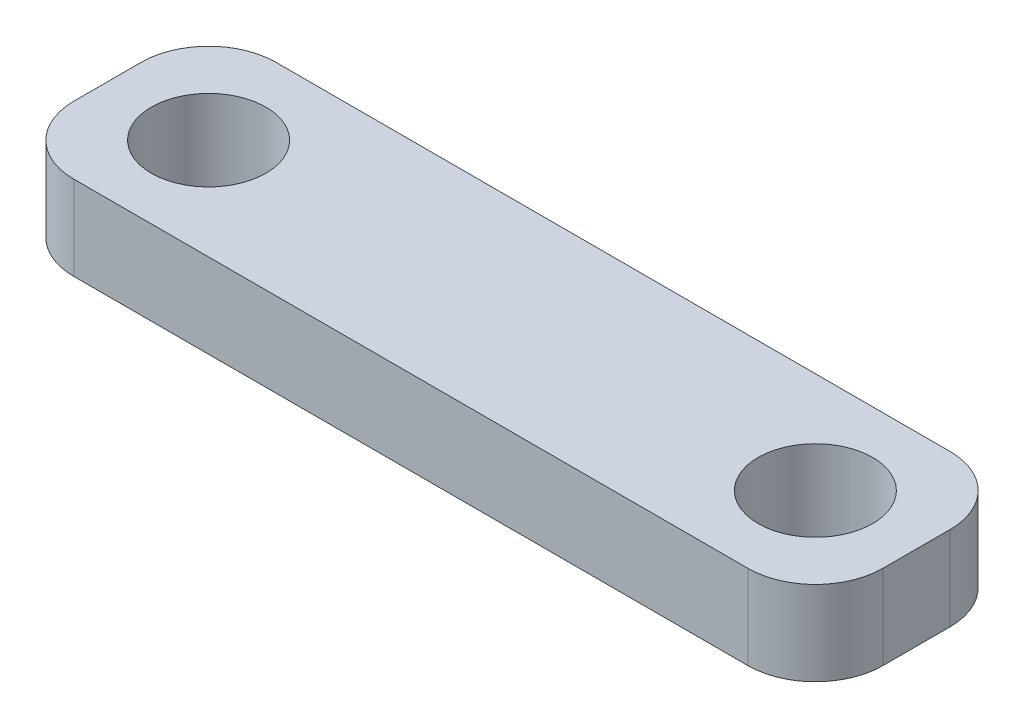
ISO-10303-21;
HEADER;
FILE_DESCRIPTION(('STEP AP214'),'2;1');
FILE_NAME('part.step','',(''),(''),'','','');
FILE_SCHEMA(('AUTOMOTIVE_DESIGN { 1 0 10303 214 1 1 1 1 }'));
ENDSEC;
DATA;
#1=APPLICATION_CONTEXT('core data for automotive mechanical design processes');
#2=APPLICATION_PROTOCOL_DEFINITION('international standard','automotive_design',2000,#1);
#3=PRODUCT_CONTEXT('',#1,'mechanical');
#4=PRODUCT('Part','Part','',(#3));
#5=PRODUCT_RELATED_PRODUCT_CATEGORY('part','',(#4));
#6=PRODUCT_DEFINITION_FORMATION('','',#4);
#7=PRODUCT_DEFINITION_CONTEXT('part definition',#1,'design');
#8=PRODUCT_DEFINITION('design','',#6,#7);
#9=PRODUCT_DEFINITION_SHAPE('','',#8);
#10=(LENGTH_UNIT() NAMED_UNIT(*) SI_UNIT(.MILLI.,.METRE.));
#11=(NAMED_UNIT(*) PLANE_ANGLE_UNIT() SI_UNIT($,.RADIAN.));
#12=(NAMED_UNIT(*) SI_UNIT($,.STERADIAN.) SOLID_ANGLE_UNIT());
#13=UNCERTAINTY_MEASURE_WITH_UNIT(LENGTH_MEASURE(1.E-05),#10,'distance_accuracy_value','');
#14=(GEOMETRIC_REPRESENTATION_CONTEXT(3) GLOBAL_UNCERTAINTY_ASSIGNED_CONTEXT((#13)) GLOBAL_UNIT_ASSIGNED_CONTEXT((#10,
#11,#12)) REPRESENTATION_CONTEXT('',''));
#15=CARTESIAN_POINT('',(0.,0.,0.));
#16=DIRECTION('',(0.,0.,1.));
#17=DIRECTION('',(1.,0.,0.));
#18=AXIS2_PLACEMENT_3D('',#15,#16,#17);
#19=CARTESIAN_POINT('',(10.,2.5,1.));
#20=DIRECTION('',(0.,1.,0.));
#21=DIRECTION('',(0.,0.,1.));
#22=AXIS2_PLACEMENT_3D('',#19,#20,#21);
#23=PLANE('',#22);
#24=CARTESIAN_POINT('',(-9.,2.5,0.));
#25=DIRECTION('',(0.,1.,0.));
#26=DIRECTION('',(0.,0.,1.));
#27=AXIS2_PLACEMENT_3D('',#24,#25,#26);
#28=CIRCLE('',#27,1.7);
#29=CARTESIAN_POINT('',(-9.,2.5,1.7));
#30=VERTEX_POINT('',#29);
#31=EDGE_CURVE('E150',#30,#30,#28,.T.);
#32=ORIENTED_EDGE('',*,*,#31,.F.);
#33=EDGE_LOOP('',(#32));
#34=FACE_BOUND('',#33,.T.);
#35=CARTESIAN_POINT('',(10.,2.5,1.));
#36=DIRECTION('',(0.,1.,0.));
#37=DIRECTION('',(0.,0.,1.));
#38=AXIS2_PLACEMENT_3D('',#35,#36,#37);
#39=CIRCLE('',#38,2.);
#40=CARTESIAN_POINT('',(9.99999999999999,2.5,3.));
#41=VERTEX_POINT('',#40);
#42=CARTESIAN_POINT('',(12.,2.5,0.999999999999987));
#43=VERTEX_POINT('',#42);
#44=EDGE_CURVE('E168',#41,#43,#39,.T.);
#45=ORIENTED_EDGE('',*,*,#44,.T.);
#46=DIRECTION('',(0.,0.,-1.));
#47=VECTOR('',#46,1.);
#48=CARTESIAN_POINT('',(12.,2.5,-0.999999999999984));
#49=LINE('',#48,#47);
#50=CARTESIAN_POINT('',(12.,2.5,-0.999999999999985));
#51=VERTEX_POINT('',#50);
#52=EDGE_CURVE('E104',#43,#51,#49,.T.);
#53=ORIENTED_EDGE('',*,*,#52,.T.);
#54=CARTESIAN_POINT('',(10.,2.5,-1.));
#55=DIRECTION('',(0.,1.,0.));
#56=DIRECTION('',(0.,0.,-1.));
#57=AXIS2_PLACEMENT_3D('',#54,#55,#56);
#58=CIRCLE('',#57,2.);
#59=CARTESIAN_POINT('',(9.99999999999999,2.5,-3.));
#60=VERTEX_POINT('',#59);
#61=EDGE_CURVE('E189',#51,#60,#58,.T.);
#62=ORIENTED_EDGE('',*,*,#61,.T.);
#63=DIRECTION('',(-1.,0.,0.));
#64=VECTOR('',#63,1.);
#65=CARTESIAN_POINT('',(-9.99999999999998,2.5,-3.));
#66=LINE('',#65,#64);
#67=CARTESIAN_POINT('',(-9.99999999999998,2.5,-3.));
#68=VERTEX_POINT('',#67);
#69=EDGE_CURVE('E203',#60,#68,#66,.T.);
#70=ORIENTED_EDGE('',*,*,#69,.T.);
#71=CARTESIAN_POINT('',(-10.,2.5,-1.));
#72=DIRECTION('',(0.,1.,0.));
#73=DIRECTION('',(0.,0.,1.));
#74=AXIS2_PLACEMENT_3D('',#71,#72,#73);
#75=CIRCLE('',#74,2.);
#76=CARTESIAN_POINT('',(-12.,2.5,-0.999999999999987));
#77=VERTEX_POINT('',#76);
#78=EDGE_CURVE('E123',#68,#77,#75,.T.);
#79=ORIENTED_EDGE('',*,*,#78,.T.);
#80=DIRECTION('',(0.,0.,1.));
#81=VECTOR('',#80,1.);
#82=CARTESIAN_POINT('',(-12.,2.5,-0.999999999999987));
#83=LINE('',#82,#81);
#84=CARTESIAN_POINT('',(-12.,2.5,0.999999999999985));
#85=VERTEX_POINT('',#84);
#86=EDGE_CURVE('E117',#77,#85,#83,.T.);
#87=ORIENTED_EDGE('',*,*,#86,.T.);
#88=CARTESIAN_POINT('',(-10.,2.5,0.999999999999999));
#89=DIRECTION('',(0.,1.,0.));
#90=DIRECTION('',(0.,0.,1.));
#91=AXIS2_PLACEMENT_3D('',#88,#89,#90);
#92=CIRCLE('',#91,2.);
#93=CARTESIAN_POINT('',(-9.99999999999998,2.5,3.));
#94=VERTEX_POINT('',#93);
#95=EDGE_CURVE('E121',#85,#94,#92,.T.);
#96=ORIENTED_EDGE('',*,*,#95,.T.);
#97=DIRECTION('',(1.,0.,0.));
#98=VECTOR('',#97,1.);
#99=CARTESIAN_POINT('',(-9.99999999999998,2.5,3.));
#100=LINE('',#99,#98);
#101=EDGE_CURVE('E61',#94,#41,#100,.T.);
#102=ORIENTED_EDGE('',*,*,#101,.T.);
#103=EDGE_LOOP('',(#45,#53,#62,#70,#79,#87,#96,#102));
#104=FACE_BOUND('',#103,.T.);
#105=CARTESIAN_POINT('',(9.,2.5,0.));
#106=DIRECTION('',(0.,1.,0.));
#107=DIRECTION('',(0.,0.,1.));
#108=AXIS2_PLACEMENT_3D('',#105,#106,#107);
#109=CIRCLE('',#108,1.7);
#110=CARTESIAN_POINT('',(9.,2.5,1.7));
#111=VERTEX_POINT('',#110);
#112=EDGE_CURVE('E217',#111,#111,#109,.T.);
#113=ORIENTED_EDGE('',*,*,#112,.F.);
#114=EDGE_LOOP('',(#113));
#115=FACE_BOUND('',#114,.T.);
#116=ADVANCED_FACE('F43',(#34,#104,#115),#23,.T.);
#117=CARTESIAN_POINT('',(10.,0.,1.));
#118=DIRECTION('',(0.,1.,0.));
#119=DIRECTION('',(0.,0.,1.));
#120=AXIS2_PLACEMENT_3D('',#117,#118,#119);
#121=PLANE('',#120);
#122=CARTESIAN_POINT('',(10.,0.,1.));
#123=DIRECTION('',(0.,1.,0.));
#124=DIRECTION('',(0.,0.,1.));
#125=AXIS2_PLACEMENT_3D('',#122,#123,#124);
#126=CIRCLE('',#125,2.);
#127=CARTESIAN_POINT('',(9.99999999999999,0.,3.));
#128=VERTEX_POINT('',#127);
#129=CARTESIAN_POINT('',(12.,0.,0.999999999999987));
#130=VERTEX_POINT('',#129);
#131=EDGE_CURVE('E145',#128,#130,#126,.T.);
#132=ORIENTED_EDGE('',*,*,#131,.F.);
#133=DIRECTION('',(1.,0.,0.));
#134=VECTOR('',#133,1.);
#135=CARTESIAN_POINT('',(-9.99999999999998,0.,3.));
#136=LINE('',#135,#134);
#137=CARTESIAN_POINT('',(-9.99999999999998,0.,3.));
#138=VERTEX_POINT('',#137);
#139=EDGE_CURVE('E96',#138,#128,#136,.T.);
#140=ORIENTED_EDGE('',*,*,#139,.F.);
#141=CARTESIAN_POINT('',(-10.,0.,0.999999999999999));
#142=DIRECTION('',(0.,1.,0.));
#143=DIRECTION('',(0.,0.,1.));
#144=AXIS2_PLACEMENT_3D('',#141,#142,#143);
#145=CIRCLE('',#144,2.);
#146=CARTESIAN_POINT('',(-12.,0.,0.999999999999985));
#147=VERTEX_POINT('',#146);
#148=EDGE_CURVE('E90',#147,#138,#145,.T.);
#149=ORIENTED_EDGE('',*,*,#148,.F.);
#150=DIRECTION('',(0.,0.,1.));
#151=VECTOR('',#150,1.);
#152=CARTESIAN_POINT('',(-12.,0.,-0.999999999999987));
#153=LINE('',#152,#151);
#154=CARTESIAN_POINT('',(-12.,0.,-0.999999999999987));
#155=VERTEX_POINT('',#154);
#156=EDGE_CURVE('E132',#155,#147,#153,.T.);
#157=ORIENTED_EDGE('',*,*,#156,.F.);
#158=CARTESIAN_POINT('',(-10.,0.,-1.));
#159=DIRECTION('',(0.,1.,0.));
#160=DIRECTION('',(0.,0.,1.));
#161=AXIS2_PLACEMENT_3D('',#158,#159,#160);
#162=CIRCLE('',#161,2.);
#163=CARTESIAN_POINT('',(-9.99999999999998,0.,-3.));
#164=VERTEX_POINT('',#163);
#165=EDGE_CURVE('E159',#164,#155,#162,.T.);
#166=ORIENTED_EDGE('',*,*,#165,.F.);
#167=DIRECTION('',(-1.,0.,0.));
#168=VECTOR('',#167,1.);
#169=CARTESIAN_POINT('',(-9.99999999999998,0.,-3.));
#170=LINE('',#169,#168);
#171=CARTESIAN_POINT('',(9.99999999999999,0.,-3.));
#172=VERTEX_POINT('',#171);
#173=EDGE_CURVE('E156',#172,#164,#170,.T.);
#174=ORIENTED_EDGE('',*,*,#173,.F.);
#175=CARTESIAN_POINT('',(10.,0.,-1.));
#176=DIRECTION('',(0.,1.,0.));
#177=DIRECTION('',(0.,0.,-1.));
#178=AXIS2_PLACEMENT_3D('',#175,#176,#177);
#179=CIRCLE('',#178,2.);
#180=CARTESIAN_POINT('',(12.,0.,-0.999999999999985));
#181=VERTEX_POINT('',#180);
#182=EDGE_CURVE('E153',#181,#172,#179,.T.);
#183=ORIENTED_EDGE('',*,*,#182,.F.);
#184=DIRECTION('',(0.,0.,-1.));
#185=VECTOR('',#184,1.);
#186=CARTESIAN_POINT('',(12.,0.,-0.999999999999984));
#187=LINE('',#186,#185);
#188=EDGE_CURVE('E149',#130,#181,#187,.T.);
#189=ORIENTED_EDGE('',*,*,#188,.F.);
#190=EDGE_LOOP('',(#132,#140,#149,#157,#166,#174,#183,#189));
#191=FACE_BOUND('',#190,.T.);
#192=CARTESIAN_POINT('',(-9.,0.,0.));
#193=DIRECTION('',(0.,1.,0.));
#194=DIRECTION('',(0.,0.,1.));
#195=AXIS2_PLACEMENT_3D('',#192,#193,#194);
#196=CIRCLE('',#195,1.7);
#197=CARTESIAN_POINT('',(-9.,0.,1.7));
#198=VERTEX_POINT('',#197);
#199=EDGE_CURVE('E213',#198,#198,#196,.T.);
#200=ORIENTED_EDGE('',*,*,#199,.T.);
#201=EDGE_LOOP('',(#200));
#202=FACE_BOUND('',#201,.T.);
#203=CARTESIAN_POINT('',(9.,0.,0.));
#204=DIRECTION('',(0.,1.,0.));
#205=DIRECTION('',(0.,0.,1.));
#206=AXIS2_PLACEMENT_3D('',#203,#204,#205);
#207=CIRCLE('',#206,1.7);
#208=CARTESIAN_POINT('',(9.,0.,1.7));
#209=VERTEX_POINT('',#208);
#210=EDGE_CURVE('E221',#209,#209,#207,.T.);
#211=ORIENTED_EDGE('',*,*,#210,.T.);
#212=EDGE_LOOP('',(#211));
#213=FACE_BOUND('',#212,.T.);
#214=ADVANCED_FACE('F193',(#191,#202,#213),#121,.F.);
#215=CARTESIAN_POINT('',(10.,2.5,1.));
#216=DIRECTION('',(0.,-1.,0.));
#217=DIRECTION('',(0.,0.,-1.));
#218=AXIS2_PLACEMENT_3D('',#215,#216,#217);
#219=CYLINDRICAL_SURFACE('',#218,2.);
#220=ORIENTED_EDGE('',*,*,#131,.T.);
#221=DIRECTION('',(0.,-1.,0.));
#222=VECTOR('',#221,1.);
#223=CARTESIAN_POINT('',(12.,2.5,0.999999999999987));
#224=LINE('',#223,#222);
#225=EDGE_CURVE('E11',#43,#130,#224,.T.);
#226=ORIENTED_EDGE('',*,*,#225,.F.);
#227=ORIENTED_EDGE('',*,*,#44,.F.);
#228=DIRECTION('',(0.,-1.,0.));
#229=VECTOR('',#228,1.);
#230=CARTESIAN_POINT('',(9.99999999999999,2.5,3.));
#231=LINE('',#230,#229);
#232=EDGE_CURVE('E141',#41,#128,#231,.T.);
#233=ORIENTED_EDGE('',*,*,#232,.T.);
#234=EDGE_LOOP('',(#220,#226,#227,#233));
#235=FACE_BOUND('',#234,.T.);
#236=ADVANCED_FACE('F45',(#235),#219,.T.);
#237=CARTESIAN_POINT('',(12.,2.5,-0.999999999999984));
#238=DIRECTION('',(-1.,0.,0.));
#239=DIRECTION('',(0.,0.,1.));
#240=AXIS2_PLACEMENT_3D('',#237,#238,#239);
#241=PLANE('',#240);
#242=ORIENTED_EDGE('',*,*,#188,.T.);
#243=DIRECTION('',(0.,-1.,0.));
#244=VECTOR('',#243,1.);
#245=CARTESIAN_POINT('',(12.,2.5,-0.999999999999985));
#246=LINE('',#245,#244);
#247=EDGE_CURVE('E53',#51,#181,#246,.T.);
#248=ORIENTED_EDGE('',*,*,#247,.F.);
#249=ORIENTED_EDGE('',*,*,#52,.F.);
#250=ORIENTED_EDGE('',*,*,#225,.T.);
#251=EDGE_LOOP('',(#242,#248,#249,#250));
#252=FACE_BOUND('',#251,.T.);
#253=ADVANCED_FACE('F255',(#252),#241,.F.);
#254=CARTESIAN_POINT('',(10.,2.5,-1.));
#255=DIRECTION('',(0.,-1.,0.));
#256=DIRECTION('',(0.,0.,-1.));
#257=AXIS2_PLACEMENT_3D('',#254,#255,#256);
#258=CYLINDRICAL_SURFACE('',#257,2.);
#259=ORIENTED_EDGE('',*,*,#182,.T.);
#260=DIRECTION('',(0.,-1.,0.));
#261=VECTOR('',#260,1.);
#262=CARTESIAN_POINT('',(9.99999999999999,2.5,-3.));
#263=LINE('',#262,#261);
#264=EDGE_CURVE('E179',#60,#172,#263,.T.);
#265=ORIENTED_EDGE('',*,*,#264,.F.);
#266=ORIENTED_EDGE('',*,*,#61,.F.);
#267=ORIENTED_EDGE('',*,*,#247,.T.);
#268=EDGE_LOOP('',(#259,#265,#266,#267));
#269=FACE_BOUND('',#268,.T.);
#270=ADVANCED_FACE('F187',(#269),#258,.T.);
#271=CARTESIAN_POINT('',(-9.99999999999998,2.5,-3.));
#272=DIRECTION('',(0.,0.,1.));
#273=DIRECTION('',(1.,0.,0.));
#274=AXIS2_PLACEMENT_3D('',#271,#272,#273);
#275=PLANE('',#274);
#276=ORIENTED_EDGE('',*,*,#173,.T.);
#277=DIRECTION('',(0.,-1.,0.));
#278=VECTOR('',#277,1.);
#279=CARTESIAN_POINT('',(-9.99999999999998,2.5,-3.));
#280=LINE('',#279,#278);
#281=EDGE_CURVE('E175',#68,#164,#280,.T.);
#282=ORIENTED_EDGE('',*,*,#281,.F.);
#283=ORIENTED_EDGE('',*,*,#69,.F.);
#284=ORIENTED_EDGE('',*,*,#264,.T.);
#285=EDGE_LOOP('',(#276,#282,#283,#284));
#286=FACE_BOUND('',#285,.T.);
#287=ADVANCED_FACE('F198',(#286),#275,.F.);
#288=CARTESIAN_POINT('',(-10.,2.5,-1.));
#289=DIRECTION('',(0.,-1.,0.));
#290=DIRECTION('',(0.,0.,-1.));
#291=AXIS2_PLACEMENT_3D('',#288,#289,#290);
#292=CYLINDRICAL_SURFACE('',#291,2.);
#293=ORIENTED_EDGE('',*,*,#165,.T.);
#294=DIRECTION('',(0.,-1.,0.));
#295=VECTOR('',#294,1.);
#296=CARTESIAN_POINT('',(-12.,2.5,-0.999999999999987));
#297=LINE('',#296,#295);
#298=EDGE_CURVE('E134',#77,#155,#297,.T.);
#299=ORIENTED_EDGE('',*,*,#298,.F.);
#300=ORIENTED_EDGE('',*,*,#78,.F.);
#301=ORIENTED_EDGE('',*,*,#281,.T.);
#302=EDGE_LOOP('',(#293,#299,#300,#301));
#303=FACE_BOUND('',#302,.T.);
#304=ADVANCED_FACE('F201',(#303),#292,.T.);
#305=CARTESIAN_POINT('',(-12.,2.5,-0.999999999999987));
#306=DIRECTION('',(1.,0.,0.));
#307=DIRECTION('',(0.,0.,-1.));
#308=AXIS2_PLACEMENT_3D('',#305,#306,#307);
#309=PLANE('',#308);
#310=ORIENTED_EDGE('',*,*,#156,.T.);
#311=DIRECTION('',(0.,-1.,0.));
#312=VECTOR('',#311,1.);
#313=CARTESIAN_POINT('',(-12.,2.5,0.999999999999985));
#314=LINE('',#313,#312);
#315=EDGE_CURVE('E129',#85,#147,#314,.T.);
#316=ORIENTED_EDGE('',*,*,#315,.F.);
#317=ORIENTED_EDGE('',*,*,#86,.F.);
#318=ORIENTED_EDGE('',*,*,#298,.T.);
#319=EDGE_LOOP('',(#310,#316,#317,#318));
#320=FACE_BOUND('',#319,.T.);
#321=ADVANCED_FACE('F130',(#320),#309,.F.);
#322=CARTESIAN_POINT('',(-10.,2.5,0.999999999999999));
#323=DIRECTION('',(0.,-1.,0.));
#324=DIRECTION('',(0.,0.,-1.));
#325=AXIS2_PLACEMENT_3D('',#322,#323,#324);
#326=CYLINDRICAL_SURFACE('',#325,2.);
#327=ORIENTED_EDGE('',*,*,#148,.T.);
#328=DIRECTION('',(0.,-1.,0.));
#329=VECTOR('',#328,1.);
#330=CARTESIAN_POINT('',(-9.99999999999998,2.5,3.));
#331=LINE('',#330,#329);
#332=EDGE_CURVE('E135',#94,#138,#331,.T.);
#333=ORIENTED_EDGE('',*,*,#332,.F.);
#334=ORIENTED_EDGE('',*,*,#95,.F.);
#335=ORIENTED_EDGE('',*,*,#315,.T.);
#336=EDGE_LOOP('',(#327,#333,#334,#335));
#337=FACE_BOUND('',#336,.T.);
#338=ADVANCED_FACE('F137',(#337),#326,.T.);
#339=CARTESIAN_POINT('',(-9.99999999999998,2.5,3.));
#340=DIRECTION('',(0.,0.,-1.));
#341=DIRECTION('',(-1.,0.,0.));
#342=AXIS2_PLACEMENT_3D('',#339,#340,#341);
#343=PLANE('',#342);
#344=ORIENTED_EDGE('',*,*,#139,.T.);
#345=ORIENTED_EDGE('',*,*,#232,.F.);
#346=ORIENTED_EDGE('',*,*,#101,.F.);
#347=ORIENTED_EDGE('',*,*,#332,.T.);
#348=EDGE_LOOP('',(#344,#345,#346,#347));
#349=FACE_BOUND('',#348,.T.);
#350=ADVANCED_FACE('F243',(#349),#343,.F.);
#351=CARTESIAN_POINT('',(-9.,2.5,0.));
#352=DIRECTION('',(0.,-1.,0.));
#353=DIRECTION('',(0.,0.,-1.));
#354=AXIS2_PLACEMENT_3D('',#351,#352,#353);
#355=CYLINDRICAL_SURFACE('',#354,1.7);
#356=ORIENTED_EDGE('',*,*,#31,.T.);
#357=EDGE_LOOP('',(#356));
#358=FACE_BOUND('',#357,.T.);
#359=ORIENTED_EDGE('',*,*,#199,.F.);
#360=EDGE_LOOP('',(#359));
#361=FACE_BOUND('',#360,.T.);
#362=ADVANCED_FACE('F240',(#358,#361),#355,.F.);
#363=CARTESIAN_POINT('',(9.,2.5,0.));
#364=DIRECTION('',(0.,-1.,0.));
#365=DIRECTION('',(0.,0.,-1.));
#366=AXIS2_PLACEMENT_3D('',#363,#364,#365);
#367=CYLINDRICAL_SURFACE('',#366,1.7);
#368=ORIENTED_EDGE('',*,*,#112,.T.);
#369=EDGE_LOOP('',(#368));
#370=FACE_BOUND('',#369,.T.);
#371=ORIENTED_EDGE('',*,*,#210,.F.);
#372=EDGE_LOOP('',(#371));
#373=FACE_BOUND('',#372,.T.);
#374=ADVANCED_FACE('F229',(#370,#373),#367,.F.);
#375=CLOSED_SHELL('',(#116,#214,#236,#253,#270,#287,#304,#321,#338,#350,#362,#374));
#376=MANIFOLD_SOLID_BREP('B2',#375);
#377=ADVANCED_BREP_SHAPE_REPRESENTATION('',(#18,#376),#14);
#378=SHAPE_DEFINITION_REPRESENTATION(#9,#377);
ENDSEC;
END-ISO-10303-21;
